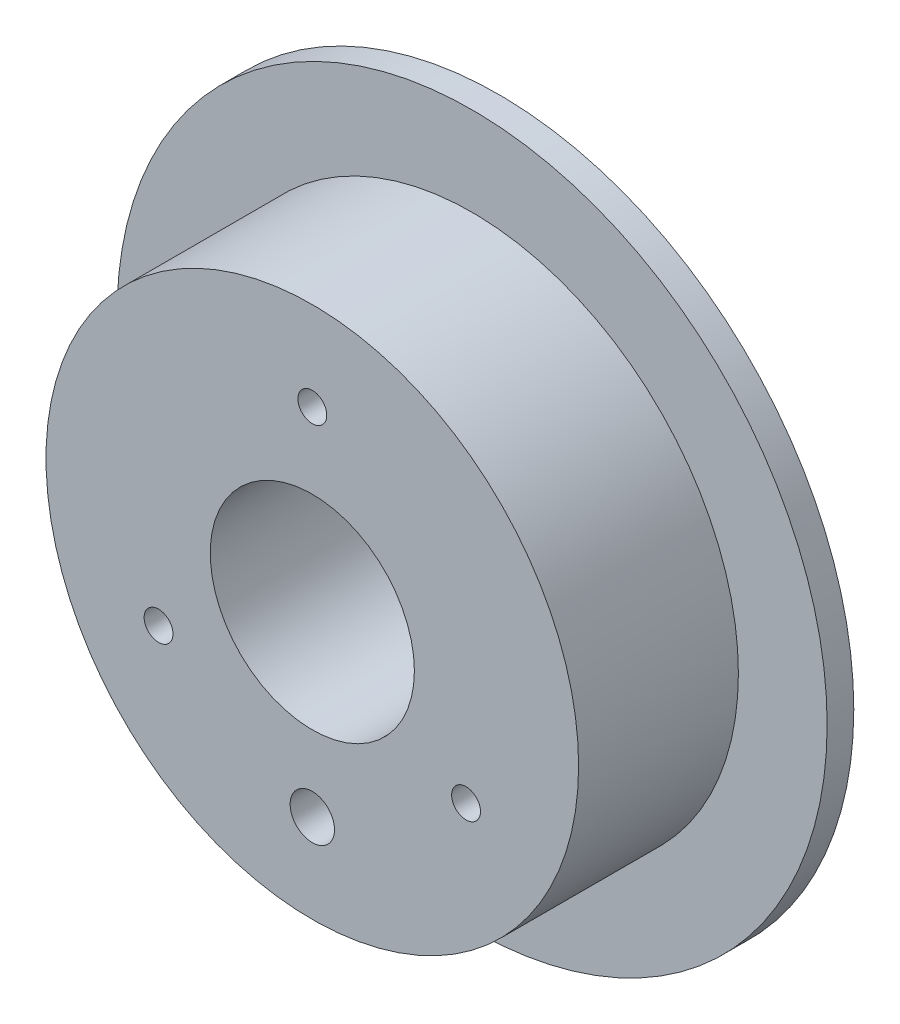
ISO-10303-21;
HEADER;
FILE_DESCRIPTION(('STEP AP214'),'2;1');
FILE_NAME('part.step','',(''),(''),'','','');
FILE_SCHEMA(('AUTOMOTIVE_DESIGN { 1 0 10303 214 1 1 1 1 }'));
ENDSEC;
DATA;
#1=APPLICATION_CONTEXT('core data for automotive mechanical design processes');
#2=APPLICATION_PROTOCOL_DEFINITION('international standard','automotive_design',2000,#1);
#3=PRODUCT_CONTEXT('',#1,'mechanical');
#4=PRODUCT('Part','Part','',(#3));
#5=PRODUCT_RELATED_PRODUCT_CATEGORY('part','',(#4));
#6=PRODUCT_DEFINITION_FORMATION('','',#4);
#7=PRODUCT_DEFINITION_CONTEXT('part definition',#1,'design');
#8=PRODUCT_DEFINITION('design','',#6,#7);
#9=PRODUCT_DEFINITION_SHAPE('','',#8);
#10=(LENGTH_UNIT() NAMED_UNIT(*) SI_UNIT(.MILLI.,.METRE.));
#11=(NAMED_UNIT(*) PLANE_ANGLE_UNIT() SI_UNIT($,.RADIAN.));
#12=(NAMED_UNIT(*) SI_UNIT($,.STERADIAN.) SOLID_ANGLE_UNIT());
#13=UNCERTAINTY_MEASURE_WITH_UNIT(LENGTH_MEASURE(1.E-05),#10,'distance_accuracy_value','');
#14=(GEOMETRIC_REPRESENTATION_CONTEXT(3) GLOBAL_UNCERTAINTY_ASSIGNED_CONTEXT((#13)) GLOBAL_UNIT_ASSIGNED_CONTEXT((#10,
#11,#12)) REPRESENTATION_CONTEXT('',''));
#15=CARTESIAN_POINT('',(0.,0.,0.));
#16=DIRECTION('',(0.,0.,1.));
#17=DIRECTION('',(1.,0.,0.));
#18=AXIS2_PLACEMENT_3D('',#15,#16,#17);
#19=CARTESIAN_POINT('',(0.,0.,3.));
#20=DIRECTION('',(0.,0.,-1.));
#21=DIRECTION('',(-1.,0.,0.));
#22=AXIS2_PLACEMENT_3D('',#19,#20,#21);
#23=CYLINDRICAL_SURFACE('',#22,40.);
#24=CARTESIAN_POINT('',(0.,0.,3.));
#25=DIRECTION('',(0.,0.,1.));
#26=DIRECTION('',(1.,0.,0.));
#27=AXIS2_PLACEMENT_3D('',#24,#25,#26);
#28=CIRCLE('',#27,40.);
#29=CARTESIAN_POINT('',(40.,0.,3.));
#30=VERTEX_POINT('',#29);
#31=EDGE_CURVE('E45',#30,#30,#28,.T.);
#32=ORIENTED_EDGE('',*,*,#31,.F.);
#33=EDGE_LOOP('',(#32));
#34=FACE_BOUND('',#33,.T.);
#35=CARTESIAN_POINT('',(0.,0.,0.));
#36=DIRECTION('',(0.,0.,1.));
#37=DIRECTION('',(1.,0.,0.));
#38=AXIS2_PLACEMENT_3D('',#35,#36,#37);
#39=CIRCLE('',#38,40.);
#40=CARTESIAN_POINT('',(40.,0.,0.));
#41=VERTEX_POINT('',#40);
#42=EDGE_CURVE('E40',#41,#41,#39,.T.);
#43=ORIENTED_EDGE('',*,*,#42,.T.);
#44=EDGE_LOOP('',(#43));
#45=FACE_BOUND('',#44,.T.);
#46=ADVANCED_FACE('F37',(#34,#45),#23,.T.);
#47=CARTESIAN_POINT('',(0.,0.,3.));
#48=DIRECTION('',(0.,0.,1.));
#49=DIRECTION('',(1.,0.,0.));
#50=AXIS2_PLACEMENT_3D('',#47,#48,#49);
#51=PLANE('',#50);
#52=CARTESIAN_POINT('',(0.,0.,3.));
#53=DIRECTION('',(0.,0.,1.));
#54=DIRECTION('',(1.,0.,0.));
#55=AXIS2_PLACEMENT_3D('',#52,#53,#54);
#56=CIRCLE('',#55,30.);
#57=CARTESIAN_POINT('',(30.,0.,3.));
#58=VERTEX_POINT('',#57);
#59=EDGE_CURVE('E10',#58,#58,#56,.T.);
#60=ORIENTED_EDGE('',*,*,#59,.F.);
#61=EDGE_LOOP('',(#60));
#62=FACE_BOUND('',#61,.T.);
#63=ORIENTED_EDGE('',*,*,#31,.T.);
#64=EDGE_LOOP('',(#63));
#65=FACE_BOUND('',#64,.T.);
#66=ADVANCED_FACE('F128',(#62,#65),#51,.T.);
#67=CARTESIAN_POINT('',(0.,0.,0.));
#68=DIRECTION('',(0.,0.,1.));
#69=DIRECTION('',(1.,0.,0.));
#70=AXIS2_PLACEMENT_3D('',#67,#68,#69);
#71=PLANE('',#70);
#72=CARTESIAN_POINT('',(0.,20.,0.));
#73=DIRECTION('',(0.,0.,1.));
#74=DIRECTION('',(1.,0.,0.));
#75=AXIS2_PLACEMENT_3D('',#72,#73,#74);
#76=CIRCLE('',#75,1.625);
#77=CARTESIAN_POINT('',(1.625,20.,0.));
#78=VERTEX_POINT('',#77);
#79=EDGE_CURVE('E56',#78,#78,#76,.T.);
#80=ORIENTED_EDGE('',*,*,#79,.T.);
#81=EDGE_LOOP('',(#80));
#82=FACE_BOUND('',#81,.T.);
#83=CARTESIAN_POINT('',(0.,-20.,0.));
#84=DIRECTION('',(0.,0.,1.));
#85=DIRECTION('',(1.,0.,0.));
#86=AXIS2_PLACEMENT_3D('',#83,#84,#85);
#87=CIRCLE('',#86,2.5);
#88=CARTESIAN_POINT('',(2.5,-20.,0.));
#89=VERTEX_POINT('',#88);
#90=EDGE_CURVE('E79',#89,#89,#87,.T.);
#91=ORIENTED_EDGE('',*,*,#90,.T.);
#92=EDGE_LOOP('',(#91));
#93=FACE_BOUND('',#92,.T.);
#94=CARTESIAN_POINT('',(-17.3205080756875,-10.0000000000007,0.));
#95=DIRECTION('',(0.,0.,1.));
#96=DIRECTION('',(1.,0.,0.));
#97=AXIS2_PLACEMENT_3D('',#94,#95,#96);
#98=CIRCLE('',#97,1.625);
#99=CARTESIAN_POINT('',(-15.6955080756875,-10.0000000000007,0.));
#100=VERTEX_POINT('',#99);
#101=EDGE_CURVE('E62',#100,#100,#98,.T.);
#102=ORIENTED_EDGE('',*,*,#101,.T.);
#103=EDGE_LOOP('',(#102));
#104=FACE_BOUND('',#103,.T.);
#105=CARTESIAN_POINT('',(17.3205080756901,-9.99999999999926,0.));
#106=DIRECTION('',(0.,0.,1.));
#107=DIRECTION('',(1.,0.,0.));
#108=AXIS2_PLACEMENT_3D('',#105,#106,#107);
#109=CIRCLE('',#108,1.625);
#110=CARTESIAN_POINT('',(18.9455080756901,-9.99999999999926,0.));
#111=VERTEX_POINT('',#110);
#112=EDGE_CURVE('E61',#111,#111,#109,.T.);
#113=ORIENTED_EDGE('',*,*,#112,.T.);
#114=EDGE_LOOP('',(#113));
#115=FACE_BOUND('',#114,.T.);
#116=CARTESIAN_POINT('',(0.,0.,0.));
#117=DIRECTION('',(0.,0.,1.));
#118=DIRECTION('',(1.,0.,0.));
#119=AXIS2_PLACEMENT_3D('',#116,#117,#118);
#120=CIRCLE('',#119,11.5);
#121=CARTESIAN_POINT('',(11.5,0.,0.));
#122=VERTEX_POINT('',#121);
#123=EDGE_CURVE('E70',#122,#122,#120,.T.);
#124=ORIENTED_EDGE('',*,*,#123,.T.);
#125=EDGE_LOOP('',(#124));
#126=FACE_BOUND('',#125,.T.);
#127=ORIENTED_EDGE('',*,*,#42,.F.);
#128=EDGE_LOOP('',(#127));
#129=FACE_BOUND('',#128,.T.);
#130=ADVANCED_FACE('F97',(#82,#93,#104,#115,#126,#129),#71,.F.);
#131=CARTESIAN_POINT('',(0.,0.,21.));
#132=DIRECTION('',(0.,0.,-1.));
#133=DIRECTION('',(-1.,0.,0.));
#134=AXIS2_PLACEMENT_3D('',#131,#132,#133);
#135=CYLINDRICAL_SURFACE('',#134,30.);
#136=CARTESIAN_POINT('',(0.,0.,21.));
#137=DIRECTION('',(0.,0.,1.));
#138=DIRECTION('',(1.,0.,0.));
#139=AXIS2_PLACEMENT_3D('',#136,#137,#138);
#140=CIRCLE('',#139,30.);
#141=CARTESIAN_POINT('',(30.,0.,21.));
#142=VERTEX_POINT('',#141);
#143=EDGE_CURVE('E52',#142,#142,#140,.T.);
#144=ORIENTED_EDGE('',*,*,#143,.F.);
#145=EDGE_LOOP('',(#144));
#146=FACE_BOUND('',#145,.T.);
#147=ORIENTED_EDGE('',*,*,#59,.T.);
#148=EDGE_LOOP('',(#147));
#149=FACE_BOUND('',#148,.T.);
#150=ADVANCED_FACE('F111',(#146,#149),#135,.T.);
#151=CARTESIAN_POINT('',(0.,0.,21.));
#152=DIRECTION('',(0.,0.,1.));
#153=DIRECTION('',(1.,0.,0.));
#154=AXIS2_PLACEMENT_3D('',#151,#152,#153);
#155=PLANE('',#154);
#156=CARTESIAN_POINT('',(0.,20.,21.));
#157=DIRECTION('',(0.,0.,1.));
#158=DIRECTION('',(1.,0.,0.));
#159=AXIS2_PLACEMENT_3D('',#156,#157,#158);
#160=CIRCLE('',#159,1.625);
#161=CARTESIAN_POINT('',(1.625,20.,21.));
#162=VERTEX_POINT('',#161);
#163=EDGE_CURVE('E74',#162,#162,#160,.T.);
#164=ORIENTED_EDGE('',*,*,#163,.F.);
#165=EDGE_LOOP('',(#164));
#166=FACE_BOUND('',#165,.T.);
#167=CARTESIAN_POINT('',(0.,-20.,21.));
#168=DIRECTION('',(0.,0.,1.));
#169=DIRECTION('',(1.,0.,0.));
#170=AXIS2_PLACEMENT_3D('',#167,#168,#169);
#171=CIRCLE('',#170,2.5);
#172=CARTESIAN_POINT('',(2.5,-20.,21.));
#173=VERTEX_POINT('',#172);
#174=EDGE_CURVE('E75',#173,#173,#171,.T.);
#175=ORIENTED_EDGE('',*,*,#174,.F.);
#176=EDGE_LOOP('',(#175));
#177=FACE_BOUND('',#176,.T.);
#178=CARTESIAN_POINT('',(-17.3205080756875,-10.0000000000007,21.));
#179=DIRECTION('',(0.,0.,1.));
#180=DIRECTION('',(1.,0.,0.));
#181=AXIS2_PLACEMENT_3D('',#178,#179,#180);
#182=CIRCLE('',#181,1.625);
#183=CARTESIAN_POINT('',(-15.6955080756875,-10.0000000000007,21.));
#184=VERTEX_POINT('',#183);
#185=EDGE_CURVE('E83',#184,#184,#182,.T.);
#186=ORIENTED_EDGE('',*,*,#185,.F.);
#187=EDGE_LOOP('',(#186));
#188=FACE_BOUND('',#187,.T.);
#189=CARTESIAN_POINT('',(17.3205080756901,-9.99999999999926,21.));
#190=DIRECTION('',(0.,0.,1.));
#191=DIRECTION('',(1.,0.,0.));
#192=AXIS2_PLACEMENT_3D('',#189,#190,#191);
#193=CIRCLE('',#192,1.625);
#194=CARTESIAN_POINT('',(18.9455080756901,-9.99999999999926,21.));
#195=VERTEX_POINT('',#194);
#196=EDGE_CURVE('E57',#195,#195,#193,.T.);
#197=ORIENTED_EDGE('',*,*,#196,.F.);
#198=EDGE_LOOP('',(#197));
#199=FACE_BOUND('',#198,.T.);
#200=CARTESIAN_POINT('',(0.,0.,21.));
#201=DIRECTION('',(0.,0.,1.));
#202=DIRECTION('',(1.,0.,0.));
#203=AXIS2_PLACEMENT_3D('',#200,#201,#202);
#204=CIRCLE('',#203,11.5);
#205=CARTESIAN_POINT('',(11.5,0.,21.));
#206=VERTEX_POINT('',#205);
#207=EDGE_CURVE('E66',#206,#206,#204,.T.);
#208=ORIENTED_EDGE('',*,*,#207,.F.);
#209=EDGE_LOOP('',(#208));
#210=FACE_BOUND('',#209,.T.);
#211=ORIENTED_EDGE('',*,*,#143,.T.);
#212=EDGE_LOOP('',(#211));
#213=FACE_BOUND('',#212,.T.);
#214=ADVANCED_FACE('F107',(#166,#177,#188,#199,#210,#213),#155,.T.);
#215=CARTESIAN_POINT('',(0.,0.,0.));
#216=DIRECTION('',(0.,0.,1.));
#217=DIRECTION('',(1.,0.,0.));
#218=AXIS2_PLACEMENT_3D('',#215,#216,#217);
#219=CYLINDRICAL_SURFACE('',#218,11.5);
#220=ORIENTED_EDGE('',*,*,#123,.F.);
#221=EDGE_LOOP('',(#220));
#222=FACE_BOUND('',#221,.T.);
#223=ORIENTED_EDGE('',*,*,#207,.T.);
#224=EDGE_LOOP('',(#223));
#225=FACE_BOUND('',#224,.T.);
#226=ADVANCED_FACE('F110',(#222,#225),#219,.F.);
#227=CARTESIAN_POINT('',(17.3205080756901,-9.99999999999926,0.));
#228=DIRECTION('',(0.,0.,1.));
#229=DIRECTION('',(1.,0.,0.));
#230=AXIS2_PLACEMENT_3D('',#227,#228,#229);
#231=CYLINDRICAL_SURFACE('',#230,1.625);
#232=ORIENTED_EDGE('',*,*,#112,.F.);
#233=EDGE_LOOP('',(#232));
#234=FACE_BOUND('',#233,.T.);
#235=ORIENTED_EDGE('',*,*,#196,.T.);
#236=EDGE_LOOP('',(#235));
#237=FACE_BOUND('',#236,.T.);
#238=ADVANCED_FACE('F166',(#234,#237),#231,.F.);
#239=CARTESIAN_POINT('',(-17.3205080756875,-10.0000000000007,0.));
#240=DIRECTION('',(0.,0.,1.));
#241=DIRECTION('',(1.,0.,0.));
#242=AXIS2_PLACEMENT_3D('',#239,#240,#241);
#243=CYLINDRICAL_SURFACE('',#242,1.625);
#244=ORIENTED_EDGE('',*,*,#101,.F.);
#245=EDGE_LOOP('',(#244));
#246=FACE_BOUND('',#245,.T.);
#247=ORIENTED_EDGE('',*,*,#185,.T.);
#248=EDGE_LOOP('',(#247));
#249=FACE_BOUND('',#248,.T.);
#250=ADVANCED_FACE('F176',(#246,#249),#243,.F.);
#251=CARTESIAN_POINT('',(0.,-20.,0.));
#252=DIRECTION('',(0.,0.,1.));
#253=DIRECTION('',(1.,0.,0.));
#254=AXIS2_PLACEMENT_3D('',#251,#252,#253);
#255=CYLINDRICAL_SURFACE('',#254,2.5);
#256=ORIENTED_EDGE('',*,*,#90,.F.);
#257=EDGE_LOOP('',(#256));
#258=FACE_BOUND('',#257,.T.);
#259=ORIENTED_EDGE('',*,*,#174,.T.);
#260=EDGE_LOOP('',(#259));
#261=FACE_BOUND('',#260,.T.);
#262=ADVANCED_FACE('F103',(#258,#261),#255,.F.);
#263=CARTESIAN_POINT('',(0.,20.,0.));
#264=DIRECTION('',(0.,0.,1.));
#265=DIRECTION('',(1.,0.,0.));
#266=AXIS2_PLACEMENT_3D('',#263,#264,#265);
#267=CYLINDRICAL_SURFACE('',#266,1.625);
#268=ORIENTED_EDGE('',*,*,#79,.F.);
#269=EDGE_LOOP('',(#268));
#270=FACE_BOUND('',#269,.T.);
#271=ORIENTED_EDGE('',*,*,#163,.T.);
#272=EDGE_LOOP('',(#271));
#273=FACE_BOUND('',#272,.T.);
#274=ADVANCED_FACE('F100',(#270,#273),#267,.F.);
#275=CLOSED_SHELL('',(#46,#66,#130,#150,#214,#226,#238,#250,#262,#274));
#276=MANIFOLD_SOLID_BREP('B2',#275);
#277=ADVANCED_BREP_SHAPE_REPRESENTATION('',(#18,#276),#14);
#278=SHAPE_DEFINITION_REPRESENTATION(#9,#277);
ENDSEC;
END-ISO-10303-21;
